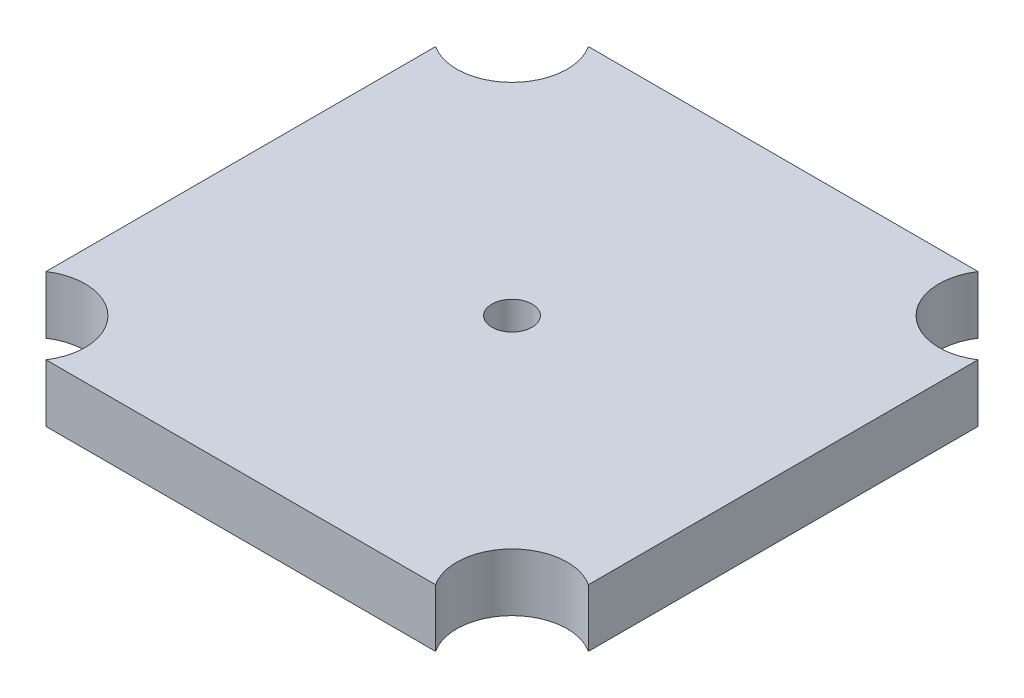
ISO-10303-21;
HEADER;
FILE_DESCRIPTION(('STEP AP214'),'2;1');
FILE_NAME('part.step','',(''),(''),'','','');
FILE_SCHEMA(('AUTOMOTIVE_DESIGN { 1 0 10303 214 1 1 1 1 }'));
ENDSEC;
DATA;
#1=APPLICATION_CONTEXT('core data for automotive mechanical design processes');
#2=APPLICATION_PROTOCOL_DEFINITION('international standard','automotive_design',2000,#1);
#3=PRODUCT_CONTEXT('',#1,'mechanical');
#4=PRODUCT('Part','Part','',(#3));
#5=PRODUCT_RELATED_PRODUCT_CATEGORY('part','',(#4));
#6=PRODUCT_DEFINITION_FORMATION('','',#4);
#7=PRODUCT_DEFINITION_CONTEXT('part definition',#1,'design');
#8=PRODUCT_DEFINITION('design','',#6,#7);
#9=PRODUCT_DEFINITION_SHAPE('','',#8);
#10=(LENGTH_UNIT() NAMED_UNIT(*) SI_UNIT(.MILLI.,.METRE.));
#11=(NAMED_UNIT(*) PLANE_ANGLE_UNIT() SI_UNIT($,.RADIAN.));
#12=(NAMED_UNIT(*) SI_UNIT($,.STERADIAN.) SOLID_ANGLE_UNIT());
#13=UNCERTAINTY_MEASURE_WITH_UNIT(LENGTH_MEASURE(1.E-05),#10,'distance_accuracy_value','');
#14=(GEOMETRIC_REPRESENTATION_CONTEXT(3) GLOBAL_UNCERTAINTY_ASSIGNED_CONTEXT((#13)) GLOBAL_UNIT_ASSIGNED_CONTEXT((#10,
#11,#12)) REPRESENTATION_CONTEXT('',''));
#15=CARTESIAN_POINT('',(0.,0.,0.));
#16=DIRECTION('',(0.,0.,1.));
#17=DIRECTION('',(1.,0.,0.));
#18=AXIS2_PLACEMENT_3D('',#15,#16,#17);
#19=CARTESIAN_POINT('',(85.725,18.25625,85.725));
#20=DIRECTION('',(-1.,0.,0.));
#21=DIRECTION('',(0.,0.,1.));
#22=AXIS2_PLACEMENT_3D('',#19,#20,#21);
#23=PLANE('',#22);
#24=DIRECTION('',(0.,0.,-1.));
#25=VECTOR('',#24,1.);
#26=CARTESIAN_POINT('',(85.725,18.25625,85.725));
#27=LINE('',#26,#25);
#28=CARTESIAN_POINT('',(85.725,18.25625,61.5639731740475));
#29=VERTEX_POINT('',#28);
#30=CARTESIAN_POINT('',(85.725,18.25625,-61.5639731740476));
#31=VERTEX_POINT('',#30);
#32=EDGE_CURVE('E129',#29,#31,#27,.T.);
#33=ORIENTED_EDGE('',*,*,#32,.F.);
#34=DIRECTION('',(0.,1.,0.));
#35=VECTOR('',#34,1.);
#36=CARTESIAN_POINT('',(85.725,0.,61.5639731740475));
#37=LINE('',#36,#35);
#38=CARTESIAN_POINT('',(85.725,0.,61.5639731740475));
#39=VERTEX_POINT('',#38);
#40=EDGE_CURVE('E155',#29,#39,#37,.F.);
#41=ORIENTED_EDGE('',*,*,#40,.T.);
#42=DIRECTION('',(0.,0.,-1.));
#43=VECTOR('',#42,1.);
#44=CARTESIAN_POINT('',(85.725,0.,85.725));
#45=LINE('',#44,#43);
#46=CARTESIAN_POINT('',(85.725,0.,-61.5639731740476));
#47=VERTEX_POINT('',#46);
#48=EDGE_CURVE('E131',#39,#47,#45,.T.);
#49=ORIENTED_EDGE('',*,*,#48,.T.);
#50=DIRECTION('',(0.,1.,0.));
#51=VECTOR('',#50,1.);
#52=CARTESIAN_POINT('',(85.725,0.,-61.5639731740476));
#53=LINE('',#52,#51);
#54=EDGE_CURVE('E163',#47,#31,#53,.T.);
#55=ORIENTED_EDGE('',*,*,#54,.T.);
#56=EDGE_LOOP('',(#33,#41,#49,#55));
#57=FACE_BOUND('',#56,.T.);
#58=ADVANCED_FACE('F37',(#57),#23,.F.);
#59=CARTESIAN_POINT('',(-85.725,18.25625,-85.725));
#60=DIRECTION('',(0.,0.,1.));
#61=DIRECTION('',(1.,0.,0.));
#62=AXIS2_PLACEMENT_3D('',#59,#60,#61);
#63=PLANE('',#62);
#64=DIRECTION('',(-1.,0.,0.));
#65=VECTOR('',#64,1.);
#66=CARTESIAN_POINT('',(-85.725,18.25625,-85.725));
#67=LINE('',#66,#65);
#68=CARTESIAN_POINT('',(61.5639731740475,18.25625,-85.725));
#69=VERTEX_POINT('',#68);
#70=CARTESIAN_POINT('',(-61.5639731740476,18.25625,-85.725));
#71=VERTEX_POINT('',#70);
#72=EDGE_CURVE('E142',#69,#71,#67,.T.);
#73=ORIENTED_EDGE('',*,*,#72,.F.);
#74=DIRECTION('',(0.,1.,0.));
#75=VECTOR('',#74,1.);
#76=CARTESIAN_POINT('',(61.5639731740475,0.,-85.725));
#77=LINE('',#76,#75);
#78=CARTESIAN_POINT('',(61.5639731740475,0.,-85.725));
#79=VERTEX_POINT('',#78);
#80=EDGE_CURVE('E167',#69,#79,#77,.F.);
#81=ORIENTED_EDGE('',*,*,#80,.T.);
#82=DIRECTION('',(-1.,0.,0.));
#83=VECTOR('',#82,1.);
#84=CARTESIAN_POINT('',(-85.725,0.,-85.725));
#85=LINE('',#84,#83);
#86=CARTESIAN_POINT('',(-61.5639731740476,0.,-85.725));
#87=VERTEX_POINT('',#86);
#88=EDGE_CURVE('E123',#79,#87,#85,.T.);
#89=ORIENTED_EDGE('',*,*,#88,.T.);
#90=DIRECTION('',(0.,1.,0.));
#91=VECTOR('',#90,1.);
#92=CARTESIAN_POINT('',(-61.5639731740476,0.,-85.725));
#93=LINE('',#92,#91);
#94=EDGE_CURVE('E52',#87,#71,#93,.T.);
#95=ORIENTED_EDGE('',*,*,#94,.T.);
#96=EDGE_LOOP('',(#73,#81,#89,#95));
#97=FACE_BOUND('',#96,.T.);
#98=ADVANCED_FACE('F212',(#97),#63,.F.);
#99=CARTESIAN_POINT('',(-85.725,18.25625,85.725));
#100=DIRECTION('',(1.,0.,0.));
#101=DIRECTION('',(0.,0.,-1.));
#102=AXIS2_PLACEMENT_3D('',#99,#100,#101);
#103=PLANE('',#102);
#104=DIRECTION('',(0.,0.,1.));
#105=VECTOR('',#104,1.);
#106=CARTESIAN_POINT('',(-85.725,0.,85.725));
#107=LINE('',#106,#105);
#108=CARTESIAN_POINT('',(-85.725,0.,-61.5639731740475));
#109=VERTEX_POINT('',#108);
#110=CARTESIAN_POINT('',(-85.725,0.,61.5639731740475));
#111=VERTEX_POINT('',#110);
#112=EDGE_CURVE('E112',#109,#111,#107,.T.);
#113=ORIENTED_EDGE('',*,*,#112,.T.);
#114=DIRECTION('',(0.,1.,0.));
#115=VECTOR('',#114,1.);
#116=CARTESIAN_POINT('',(-85.725,0.,61.5639731740475));
#117=LINE('',#116,#115);
#118=CARTESIAN_POINT('',(-85.725,18.25625,61.5639731740475));
#119=VERTEX_POINT('',#118);
#120=EDGE_CURVE('E60',#111,#119,#117,.T.);
#121=ORIENTED_EDGE('',*,*,#120,.T.);
#122=DIRECTION('',(0.,0.,1.));
#123=VECTOR('',#122,1.);
#124=CARTESIAN_POINT('',(-85.725,18.25625,85.725));
#125=LINE('',#124,#123);
#126=CARTESIAN_POINT('',(-85.725,18.25625,-61.5639731740475));
#127=VERTEX_POINT('',#126);
#128=EDGE_CURVE('E114',#127,#119,#125,.T.);
#129=ORIENTED_EDGE('',*,*,#128,.F.);
#130=DIRECTION('',(0.,1.,0.));
#131=VECTOR('',#130,1.);
#132=CARTESIAN_POINT('',(-85.725,0.,-61.5639731740475));
#133=LINE('',#132,#131);
#134=EDGE_CURVE('E100',#127,#109,#133,.F.);
#135=ORIENTED_EDGE('',*,*,#134,.T.);
#136=EDGE_LOOP('',(#113,#121,#129,#135));
#137=FACE_BOUND('',#136,.T.);
#138=ADVANCED_FACE('F111',(#137),#103,.F.);
#139=CARTESIAN_POINT('',(-85.725,18.25625,85.725));
#140=DIRECTION('',(0.,0.,-1.));
#141=DIRECTION('',(-1.,0.,0.));
#142=AXIS2_PLACEMENT_3D('',#139,#140,#141);
#143=PLANE('',#142);
#144=DIRECTION('',(1.,0.,0.));
#145=VECTOR('',#144,1.);
#146=CARTESIAN_POINT('',(-85.725,18.25625,85.725));
#147=LINE('',#146,#145);
#148=CARTESIAN_POINT('',(-61.5639731740475,18.25625,85.725));
#149=VERTEX_POINT('',#148);
#150=CARTESIAN_POINT('',(61.5639731740476,18.25625,85.725));
#151=VERTEX_POINT('',#150);
#152=EDGE_CURVE('E107',#149,#151,#147,.T.);
#153=ORIENTED_EDGE('',*,*,#152,.F.);
#154=DIRECTION('',(0.,1.,0.));
#155=VECTOR('',#154,1.);
#156=CARTESIAN_POINT('',(-61.5639731740475,0.,85.725));
#157=LINE('',#156,#155);
#158=CARTESIAN_POINT('',(-61.5639731740475,0.,85.725));
#159=VERTEX_POINT('',#158);
#160=EDGE_CURVE('E151',#149,#159,#157,.F.);
#161=ORIENTED_EDGE('',*,*,#160,.T.);
#162=DIRECTION('',(1.,0.,0.));
#163=VECTOR('',#162,1.);
#164=CARTESIAN_POINT('',(-85.725,0.,85.725));
#165=LINE('',#164,#163);
#166=CARTESIAN_POINT('',(61.5639731740476,0.,85.725));
#167=VERTEX_POINT('',#166);
#168=EDGE_CURVE('E122',#159,#167,#165,.T.);
#169=ORIENTED_EDGE('',*,*,#168,.T.);
#170=DIRECTION('',(0.,1.,0.));
#171=VECTOR('',#170,1.);
#172=CARTESIAN_POINT('',(61.5639731740476,0.,85.725));
#173=LINE('',#172,#171);
#174=EDGE_CURVE('E159',#167,#151,#173,.T.);
#175=ORIENTED_EDGE('',*,*,#174,.T.);
#176=EDGE_LOOP('',(#153,#161,#169,#175));
#177=FACE_BOUND('',#176,.T.);
#178=ADVANCED_FACE('F205',(#177),#143,.F.);
#179=CARTESIAN_POINT('',(0.,18.25625,0.));
#180=DIRECTION('',(0.,-1.,0.));
#181=DIRECTION('',(0.,0.,-1.));
#182=AXIS2_PLACEMENT_3D('',#179,#180,#181);
#183=PLANE('',#182);
#184=CARTESIAN_POINT('',(0.,18.25625,0.));
#185=DIRECTION('',(0.,1.,0.));
#186=DIRECTION('',(0.,0.,1.));
#187=AXIS2_PLACEMENT_3D('',#184,#185,#186);
#188=CIRCLE('',#187,6.35);
#189=CARTESIAN_POINT('',(0.,18.25625,6.35));
#190=VERTEX_POINT('',#189);
#191=EDGE_CURVE('E194',#190,#190,#188,.T.);
#192=ORIENTED_EDGE('',*,*,#191,.F.);
#193=EDGE_LOOP('',(#192));
#194=FACE_BOUND('',#193,.T.);
#195=ORIENTED_EDGE('',*,*,#128,.T.);
#196=CARTESIAN_POINT('',(-76.2,18.25625,76.2));
#197=DIRECTION('',(0.,1.,0.));
#198=DIRECTION('',(0.,0.,1.));
#199=AXIS2_PLACEMENT_3D('',#196,#197,#198);
#200=CIRCLE('',#199,17.4625);
#201=EDGE_CURVE('E176',#149,#119,#200,.T.);
#202=ORIENTED_EDGE('',*,*,#201,.F.);
#203=ORIENTED_EDGE('',*,*,#152,.T.);
#204=CARTESIAN_POINT('',(76.2,18.25625,76.2));
#205=DIRECTION('',(0.,1.,0.));
#206=DIRECTION('',(0.,0.,1.));
#207=AXIS2_PLACEMENT_3D('',#204,#205,#206);
#208=CIRCLE('',#207,17.4625);
#209=EDGE_CURVE('E182',#29,#151,#208,.T.);
#210=ORIENTED_EDGE('',*,*,#209,.F.);
#211=ORIENTED_EDGE('',*,*,#32,.T.);
#212=CARTESIAN_POINT('',(76.2,18.25625,-76.2));
#213=DIRECTION('',(0.,1.,0.));
#214=DIRECTION('',(0.,0.,1.));
#215=AXIS2_PLACEMENT_3D('',#212,#213,#214);
#216=CIRCLE('',#215,17.4625);
#217=EDGE_CURVE('E175',#69,#31,#216,.T.);
#218=ORIENTED_EDGE('',*,*,#217,.F.);
#219=ORIENTED_EDGE('',*,*,#72,.T.);
#220=CARTESIAN_POINT('',(-76.2,18.25625,-76.2));
#221=DIRECTION('',(0.,1.,0.));
#222=DIRECTION('',(0.,0.,1.));
#223=AXIS2_PLACEMENT_3D('',#220,#221,#222);
#224=CIRCLE('',#223,17.4625);
#225=EDGE_CURVE('E116',#127,#71,#224,.T.);
#226=ORIENTED_EDGE('',*,*,#225,.F.);
#227=EDGE_LOOP('',(#195,#202,#203,#210,#211,#218,#219,#226));
#228=FACE_BOUND('',#227,.T.);
#229=ADVANCED_FACE('F202',(#194,#228),#183,.F.);
#230=CARTESIAN_POINT('',(0.,0.,0.));
#231=DIRECTION('',(0.,-1.,0.));
#232=DIRECTION('',(0.,0.,-1.));
#233=AXIS2_PLACEMENT_3D('',#230,#231,#232);
#234=PLANE('',#233);
#235=CARTESIAN_POINT('',(0.,0.,0.));
#236=DIRECTION('',(0.,1.,0.));
#237=DIRECTION('',(0.,0.,1.));
#238=AXIS2_PLACEMENT_3D('',#235,#236,#237);
#239=CIRCLE('',#238,6.35);
#240=CARTESIAN_POINT('',(0.,0.,6.35));
#241=VERTEX_POINT('',#240);
#242=EDGE_CURVE('E179',#241,#241,#239,.T.);
#243=ORIENTED_EDGE('',*,*,#242,.T.);
#244=EDGE_LOOP('',(#243));
#245=FACE_BOUND('',#244,.T.);
#246=CARTESIAN_POINT('',(-76.2,0.,76.2));
#247=DIRECTION('',(0.,1.,0.));
#248=DIRECTION('',(0.,0.,1.));
#249=AXIS2_PLACEMENT_3D('',#246,#247,#248);
#250=CIRCLE('',#249,17.4625);
#251=EDGE_CURVE('E120',#159,#111,#250,.T.);
#252=ORIENTED_EDGE('',*,*,#251,.T.);
#253=ORIENTED_EDGE('',*,*,#112,.F.);
#254=CARTESIAN_POINT('',(-76.2,0.,-76.2));
#255=DIRECTION('',(0.,-1.,0.));
#256=DIRECTION('',(0.,0.,-1.));
#257=AXIS2_PLACEMENT_3D('',#254,#255,#256);
#258=CIRCLE('',#257,17.4625);
#259=EDGE_CURVE('E45',#87,#109,#258,.T.);
#260=ORIENTED_EDGE('',*,*,#259,.F.);
#261=ORIENTED_EDGE('',*,*,#88,.F.);
#262=CARTESIAN_POINT('',(76.2,0.,-76.2));
#263=DIRECTION('',(0.,-1.,0.));
#264=DIRECTION('',(0.,0.,-1.));
#265=AXIS2_PLACEMENT_3D('',#262,#263,#264);
#266=CIRCLE('',#265,17.4625);
#267=EDGE_CURVE('E11',#47,#79,#266,.T.);
#268=ORIENTED_EDGE('',*,*,#267,.F.);
#269=ORIENTED_EDGE('',*,*,#48,.F.);
#270=CARTESIAN_POINT('',(76.2,0.,76.2));
#271=DIRECTION('',(0.,1.,0.));
#272=DIRECTION('',(0.,0.,1.));
#273=AXIS2_PLACEMENT_3D('',#270,#271,#272);
#274=CIRCLE('',#273,17.4625);
#275=EDGE_CURVE('E185',#39,#167,#274,.T.);
#276=ORIENTED_EDGE('',*,*,#275,.T.);
#277=ORIENTED_EDGE('',*,*,#168,.F.);
#278=EDGE_LOOP('',(#252,#253,#260,#261,#268,#269,#276,#277));
#279=FACE_BOUND('',#278,.T.);
#280=ADVANCED_FACE('F118',(#245,#279),#234,.T.);
#281=CARTESIAN_POINT('',(-76.2,0.,-76.2));
#282=DIRECTION('',(0.,1.,0.));
#283=DIRECTION('',(0.,0.,1.));
#284=AXIS2_PLACEMENT_3D('',#281,#282,#283);
#285=CYLINDRICAL_SURFACE('',#284,17.4625);
#286=ORIENTED_EDGE('',*,*,#259,.T.);
#287=ORIENTED_EDGE('',*,*,#134,.F.);
#288=ORIENTED_EDGE('',*,*,#225,.T.);
#289=ORIENTED_EDGE('',*,*,#94,.F.);
#290=EDGE_LOOP('',(#286,#287,#288,#289));
#291=FACE_BOUND('',#290,.T.);
#292=ADVANCED_FACE('F99',(#291),#285,.F.);
#293=CARTESIAN_POINT('',(76.2,0.,-76.2));
#294=DIRECTION('',(0.,1.,0.));
#295=DIRECTION('',(0.,0.,1.));
#296=AXIS2_PLACEMENT_3D('',#293,#294,#295);
#297=CYLINDRICAL_SURFACE('',#296,17.4625);
#298=ORIENTED_EDGE('',*,*,#267,.T.);
#299=ORIENTED_EDGE('',*,*,#80,.F.);
#300=ORIENTED_EDGE('',*,*,#217,.T.);
#301=ORIENTED_EDGE('',*,*,#54,.F.);
#302=EDGE_LOOP('',(#298,#299,#300,#301));
#303=FACE_BOUND('',#302,.T.);
#304=ADVANCED_FACE('F231',(#303),#297,.F.);
#305=CARTESIAN_POINT('',(76.2,0.,76.2));
#306=DIRECTION('',(0.,1.,0.));
#307=DIRECTION('',(0.,0.,1.));
#308=AXIS2_PLACEMENT_3D('',#305,#306,#307);
#309=CYLINDRICAL_SURFACE('',#308,17.4625);
#310=ORIENTED_EDGE('',*,*,#209,.T.);
#311=ORIENTED_EDGE('',*,*,#174,.F.);
#312=ORIENTED_EDGE('',*,*,#275,.F.);
#313=ORIENTED_EDGE('',*,*,#40,.F.);
#314=EDGE_LOOP('',(#310,#311,#312,#313));
#315=FACE_BOUND('',#314,.T.);
#316=ADVANCED_FACE('F220',(#315),#309,.F.);
#317=CARTESIAN_POINT('',(-76.2,0.,76.2));
#318=DIRECTION('',(0.,1.,0.));
#319=DIRECTION('',(0.,0.,1.));
#320=AXIS2_PLACEMENT_3D('',#317,#318,#319);
#321=CYLINDRICAL_SURFACE('',#320,17.4625);
#322=ORIENTED_EDGE('',*,*,#251,.F.);
#323=ORIENTED_EDGE('',*,*,#160,.F.);
#324=ORIENTED_EDGE('',*,*,#201,.T.);
#325=ORIENTED_EDGE('',*,*,#120,.F.);
#326=EDGE_LOOP('',(#322,#323,#324,#325));
#327=FACE_BOUND('',#326,.T.);
#328=ADVANCED_FACE('F222',(#327),#321,.F.);
#329=CARTESIAN_POINT('',(0.,18.25625,0.));
#330=DIRECTION('',(0.,1.,0.));
#331=DIRECTION('',(0.,0.,1.));
#332=AXIS2_PLACEMENT_3D('',#329,#330,#331);
#333=CYLINDRICAL_SURFACE('',#332,6.35);
#334=ORIENTED_EDGE('',*,*,#242,.F.);
#335=EDGE_LOOP('',(#334));
#336=FACE_BOUND('',#335,.T.);
#337=ORIENTED_EDGE('',*,*,#191,.T.);
#338=EDGE_LOOP('',(#337));
#339=FACE_BOUND('',#338,.T.);
#340=ADVANCED_FACE('F200',(#336,#339),#333,.F.);
#341=CLOSED_SHELL('',(#58,#98,#138,#178,#229,#280,#292,#304,#316,#328,#340));
#342=MANIFOLD_SOLID_BREP('B2',#341);
#343=ADVANCED_BREP_SHAPE_REPRESENTATION('',(#18,#342),#14);
#344=SHAPE_DEFINITION_REPRESENTATION(#9,#343);
ENDSEC;
END-ISO-10303-21;
